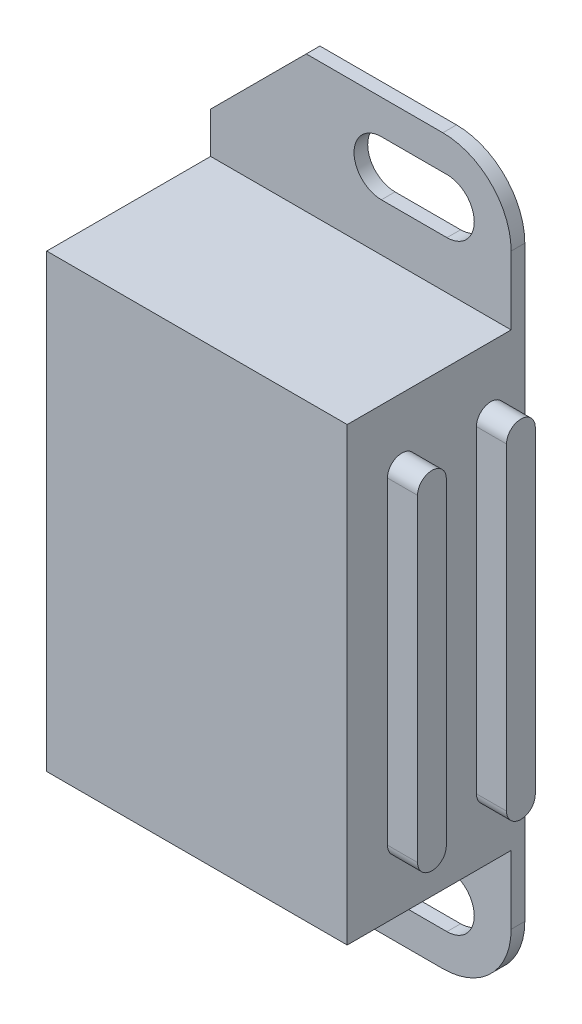
ISO-10303-21;
HEADER;
FILE_DESCRIPTION(('STEP AP214'),'2;1');
FILE_NAME('part.step','',(''),(''),'','','');
FILE_SCHEMA(('AUTOMOTIVE_DESIGN { 1 0 10303 214 1 1 1 1 }'));
ENDSEC;
DATA;
#1=APPLICATION_CONTEXT('core data for automotive mechanical design processes');
#2=APPLICATION_PROTOCOL_DEFINITION('international standard','automotive_design',2000,#1);
#3=PRODUCT_CONTEXT('',#1,'mechanical');
#4=PRODUCT('Part','Part','',(#3));
#5=PRODUCT_RELATED_PRODUCT_CATEGORY('part','',(#4));
#6=PRODUCT_DEFINITION_FORMATION('','',#4);
#7=PRODUCT_DEFINITION_CONTEXT('part definition',#1,'design');
#8=PRODUCT_DEFINITION('design','',#6,#7);
#9=PRODUCT_DEFINITION_SHAPE('','',#8);
#10=(LENGTH_UNIT() NAMED_UNIT(*) SI_UNIT(.MILLI.,.METRE.));
#11=(NAMED_UNIT(*) PLANE_ANGLE_UNIT() SI_UNIT($,.RADIAN.));
#12=(NAMED_UNIT(*) SI_UNIT($,.STERADIAN.) SOLID_ANGLE_UNIT());
#13=UNCERTAINTY_MEASURE_WITH_UNIT(LENGTH_MEASURE(1.E-05),#10,'distance_accuracy_value','');
#14=(GEOMETRIC_REPRESENTATION_CONTEXT(3) GLOBAL_UNCERTAINTY_ASSIGNED_CONTEXT((#13)) GLOBAL_UNIT_ASSIGNED_CONTEXT((#10,
#11,#12)) REPRESENTATION_CONTEXT('',''));
#15=CARTESIAN_POINT('',(0.,0.,0.));
#16=DIRECTION('',(0.,0.,1.));
#17=DIRECTION('',(1.,0.,0.));
#18=AXIS2_PLACEMENT_3D('',#15,#16,#17);
#19=CARTESIAN_POINT('',(11.,-26.5,1.));
#20=DIRECTION('',(-1.,0.,0.));
#21=DIRECTION('',(0.,0.,1.));
#22=AXIS2_PLACEMENT_3D('',#19,#20,#21);
#23=PLANE('',#22);
#24=CARTESIAN_POINT('',(11.,-11.6386215895724,9.));
#25=DIRECTION('',(1.,0.,0.));
#26=DIRECTION('',(0.,0.,-1.));
#27=AXIS2_PLACEMENT_3D('',#24,#25,#26);
#28=CIRCLE('',#27,1.05406384207447);
#29=CARTESIAN_POINT('',(11.,-11.6386215895724,10.0540638420745));
#30=VERTEX_POINT('',#29);
#31=CARTESIAN_POINT('',(11.,-11.6386215895724,7.94593615792553));
#32=VERTEX_POINT('',#31);
#33=EDGE_CURVE('E248',#30,#32,#28,.T.);
#34=ORIENTED_EDGE('',*,*,#33,.F.);
#35=DIRECTION('',(0.,-1.,0.));
#36=VECTOR('',#35,1.);
#37=CARTESIAN_POINT('',(11.,-11.6386215895724,10.0540638420745));
#38=LINE('',#37,#36);
#39=CARTESIAN_POINT('',(11.,11.6386215895724,10.0540638420745));
#40=VERTEX_POINT('',#39);
#41=EDGE_CURVE('E261',#40,#30,#38,.T.);
#42=ORIENTED_EDGE('',*,*,#41,.F.);
#43=CARTESIAN_POINT('',(11.,11.6386215895724,9.));
#44=DIRECTION('',(1.,0.,0.));
#45=DIRECTION('',(0.,0.,-1.));
#46=AXIS2_PLACEMENT_3D('',#43,#44,#45);
#47=CIRCLE('',#46,1.05406384207447);
#48=CARTESIAN_POINT('',(11.,11.6386215895724,7.94593615792553));
#49=VERTEX_POINT('',#48);
#50=EDGE_CURVE('E270',#49,#40,#47,.T.);
#51=ORIENTED_EDGE('',*,*,#50,.F.);
#52=DIRECTION('',(0.,1.,0.));
#53=VECTOR('',#52,1.);
#54=CARTESIAN_POINT('',(11.,-11.6386215895724,7.94593615792553));
#55=LINE('',#54,#53);
#56=EDGE_CURVE('E251',#32,#49,#55,.T.);
#57=ORIENTED_EDGE('',*,*,#56,.F.);
#58=EDGE_LOOP('',(#34,#42,#51,#57));
#59=FACE_BOUND('',#58,.T.);
#60=DIRECTION('',(0.,1.,0.));
#61=VECTOR('',#60,1.);
#62=CARTESIAN_POINT('',(11.,-26.5,1.));
#63=LINE('',#62,#61);
#64=CARTESIAN_POINT('',(11.,-21.5,1.));
#65=VERTEX_POINT('',#64);
#66=CARTESIAN_POINT('',(11.,-16.5,1.));
#67=VERTEX_POINT('',#66);
#68=EDGE_CURVE('E362',#65,#67,#63,.T.);
#69=ORIENTED_EDGE('',*,*,#68,.F.);
#70=DIRECTION('',(0.,0.,-1.));
#71=VECTOR('',#70,1.);
#72=CARTESIAN_POINT('',(11.,-21.5,1.));
#73=LINE('',#72,#71);
#74=CARTESIAN_POINT('',(11.,-21.5,0.));
#75=VERTEX_POINT('',#74);
#76=EDGE_CURVE('E375',#65,#75,#73,.T.);
#77=ORIENTED_EDGE('',*,*,#76,.T.);
#78=DIRECTION('',(0.,1.,0.));
#79=VECTOR('',#78,1.);
#80=CARTESIAN_POINT('',(11.,-26.5,0.));
#81=LINE('',#80,#79);
#82=CARTESIAN_POINT('',(11.,21.5,0.));
#83=VERTEX_POINT('',#82);
#84=EDGE_CURVE('E351',#75,#83,#81,.T.);
#85=ORIENTED_EDGE('',*,*,#84,.T.);
#86=DIRECTION('',(0.,0.,-1.));
#87=VECTOR('',#86,1.);
#88=CARTESIAN_POINT('',(11.,21.5,1.));
#89=LINE('',#88,#87);
#90=CARTESIAN_POINT('',(11.,21.5,1.));
#91=VERTEX_POINT('',#90);
#92=EDGE_CURVE('E373',#83,#91,#89,.F.);
#93=ORIENTED_EDGE('',*,*,#92,.T.);
#94=CARTESIAN_POINT('',(11.,16.5,1.));
#95=VERTEX_POINT('',#94);
#96=EDGE_CURVE('E361',#95,#91,#63,.T.);
#97=ORIENTED_EDGE('',*,*,#96,.F.);
#98=DIRECTION('',(0.,0.,-1.));
#99=VECTOR('',#98,1.);
#100=CARTESIAN_POINT('',(11.,16.5,13.));
#101=LINE('',#100,#99);
#102=CARTESIAN_POINT('',(11.,16.5,13.));
#103=VERTEX_POINT('',#102);
#104=EDGE_CURVE('E312',#103,#95,#101,.T.);
#105=ORIENTED_EDGE('',*,*,#104,.F.);
#106=DIRECTION('',(0.,1.,0.));
#107=VECTOR('',#106,1.);
#108=CARTESIAN_POINT('',(11.,-16.5,13.));
#109=LINE('',#108,#107);
#110=CARTESIAN_POINT('',(11.,-16.5,13.));
#111=VERTEX_POINT('',#110);
#112=EDGE_CURVE('E287',#111,#103,#109,.T.);
#113=ORIENTED_EDGE('',*,*,#112,.F.);
#114=DIRECTION('',(0.,0.,-1.));
#115=VECTOR('',#114,1.);
#116=CARTESIAN_POINT('',(11.,-16.5,13.));
#117=LINE('',#116,#115);
#118=EDGE_CURVE('E297',#111,#67,#117,.T.);
#119=ORIENTED_EDGE('',*,*,#118,.T.);
#120=EDGE_LOOP('',(#69,#77,#85,#93,#97,#105,#113,#119));
#121=FACE_BOUND('',#120,.T.);
#122=CARTESIAN_POINT('',(11.,-11.6386215895724,2.4863975939691));
#123=DIRECTION('',(1.,0.,0.));
#124=DIRECTION('',(0.,0.,1.));
#125=AXIS2_PLACEMENT_3D('',#122,#123,#124);
#126=CIRCLE('',#125,1.05406384207447);
#127=CARTESIAN_POINT('',(11.,-11.6386215895724,3.54046143604357));
#128=VERTEX_POINT('',#127);
#129=CARTESIAN_POINT('',(11.,-11.6386215895724,1.43233375189462));
#130=VERTEX_POINT('',#129);
#131=EDGE_CURVE('E247',#128,#130,#126,.T.);
#132=ORIENTED_EDGE('',*,*,#131,.F.);
#133=DIRECTION('',(0.,-1.,0.));
#134=VECTOR('',#133,1.);
#135=CARTESIAN_POINT('',(11.,-11.6386215895724,3.54046143604357));
#136=LINE('',#135,#134);
#137=CARTESIAN_POINT('',(11.,11.6386215895724,3.54046143604357));
#138=VERTEX_POINT('',#137);
#139=EDGE_CURVE('E244',#138,#128,#136,.T.);
#140=ORIENTED_EDGE('',*,*,#139,.F.);
#141=CARTESIAN_POINT('',(11.,11.6386215895724,2.4863975939691));
#142=DIRECTION('',(1.,0.,0.));
#143=DIRECTION('',(0.,0.,1.));
#144=AXIS2_PLACEMENT_3D('',#141,#142,#143);
#145=CIRCLE('',#144,1.05406384207447);
#146=CARTESIAN_POINT('',(11.,11.6386215895724,1.43233375189462));
#147=VERTEX_POINT('',#146);
#148=EDGE_CURVE('E835',#147,#138,#145,.T.);
#149=ORIENTED_EDGE('',*,*,#148,.F.);
#150=DIRECTION('',(0.,1.,0.));
#151=VECTOR('',#150,1.);
#152=CARTESIAN_POINT('',(11.,-11.6386215895724,1.43233375189462));
#153=LINE('',#152,#151);
#154=EDGE_CURVE('E841',#130,#147,#153,.T.);
#155=ORIENTED_EDGE('',*,*,#154,.F.);
#156=EDGE_LOOP('',(#132,#140,#149,#155));
#157=FACE_BOUND('',#156,.T.);
#158=ADVANCED_FACE('F37',(#59,#121,#157),#23,.F.);
#159=CARTESIAN_POINT('',(11.,26.5,1.));
#160=DIRECTION('',(0.,0.,-1.));
#161=DIRECTION('',(-1.,0.,0.));
#162=AXIS2_PLACEMENT_3D('',#159,#160,#161);
#163=PLANE('',#162);
#164=CARTESIAN_POINT('',(1.49999999999999,-22.,1.));
#165=DIRECTION('',(0.,0.,-1.));
#166=DIRECTION('',(1.,0.,0.));
#167=AXIS2_PLACEMENT_3D('',#164,#165,#166);
#168=CIRCLE('',#167,2.);
#169=CARTESIAN_POINT('',(1.49999999999999,-24.,1.));
#170=VERTEX_POINT('',#169);
#171=CARTESIAN_POINT('',(1.49999999999999,-20.,1.));
#172=VERTEX_POINT('',#171);
#173=EDGE_CURVE('E318',#170,#172,#168,.T.);
#174=ORIENTED_EDGE('',*,*,#173,.T.);
#175=DIRECTION('',(1.,0.,0.));
#176=VECTOR('',#175,1.);
#177=CARTESIAN_POINT('',(1.49999999999999,-20.,1.));
#178=LINE('',#177,#176);
#179=CARTESIAN_POINT('',(6.29999999999999,-20.,1.));
#180=VERTEX_POINT('',#179);
#181=EDGE_CURVE('E787',#172,#180,#178,.T.);
#182=ORIENTED_EDGE('',*,*,#181,.T.);
#183=CARTESIAN_POINT('',(6.29999999999999,-22.,1.));
#184=DIRECTION('',(0.,0.,-1.));
#185=DIRECTION('',(1.,0.,0.));
#186=AXIS2_PLACEMENT_3D('',#183,#184,#185);
#187=CIRCLE('',#186,1.99999999999999);
#188=CARTESIAN_POINT('',(6.29999999999999,-24.,1.));
#189=VERTEX_POINT('',#188);
#190=EDGE_CURVE('E791',#180,#189,#187,.T.);
#191=ORIENTED_EDGE('',*,*,#190,.T.);
#192=DIRECTION('',(-1.,0.,0.));
#193=VECTOR('',#192,1.);
#194=CARTESIAN_POINT('',(1.49999999999999,-24.,1.));
#195=LINE('',#194,#193);
#196=EDGE_CURVE('E794',#189,#170,#195,.T.);
#197=ORIENTED_EDGE('',*,*,#196,.T.);
#198=EDGE_LOOP('',(#174,#182,#191,#197));
#199=FACE_BOUND('',#198,.T.);
#200=DIRECTION('',(1.,0.,0.));
#201=VECTOR('',#200,1.);
#202=CARTESIAN_POINT('',(-11.,-26.5,1.));
#203=LINE('',#202,#201);
#204=CARTESIAN_POINT('',(-4.00000000000001,-26.5,1.));
#205=VERTEX_POINT('',#204);
#206=CARTESIAN_POINT('',(5.99999999999999,-26.5,1.));
#207=VERTEX_POINT('',#206);
#208=EDGE_CURVE('E335',#205,#207,#203,.T.);
#209=ORIENTED_EDGE('',*,*,#208,.T.);
#210=CARTESIAN_POINT('',(6.,-21.5,1.));
#211=DIRECTION('',(0.,0.,-1.));
#212=DIRECTION('',(-1.,0.,0.));
#213=AXIS2_PLACEMENT_3D('',#210,#211,#212);
#214=CIRCLE('',#213,5.);
#215=EDGE_CURVE('E383',#207,#65,#214,.F.);
#216=ORIENTED_EDGE('',*,*,#215,.T.);
#217=ORIENTED_EDGE('',*,*,#68,.T.);
#218=DIRECTION('',(1.,0.,0.));
#219=VECTOR('',#218,1.);
#220=CARTESIAN_POINT('',(-11.,-16.5,1.));
#221=LINE('',#220,#219);
#222=CARTESIAN_POINT('',(-11.,-16.5,1.));
#223=VERTEX_POINT('',#222);
#224=EDGE_CURVE('E291',#223,#67,#221,.T.);
#225=ORIENTED_EDGE('',*,*,#224,.F.);
#226=DIRECTION('',(0.,-1.,0.));
#227=VECTOR('',#226,1.);
#228=CARTESIAN_POINT('',(-11.,-26.5,1.));
#229=LINE('',#228,#227);
#230=CARTESIAN_POINT('',(-11.,-19.5,1.));
#231=VERTEX_POINT('',#230);
#232=EDGE_CURVE('E306',#223,#231,#229,.T.);
#233=ORIENTED_EDGE('',*,*,#232,.T.);
#234=DIRECTION('',(-0.707106781186546,0.707106781186549,0.));
#235=VECTOR('',#234,1.);
#236=CARTESIAN_POINT('',(-4.00000000000001,-26.5,1.));
#237=LINE('',#236,#235);
#238=EDGE_CURVE('E403',#231,#205,#237,.F.);
#239=ORIENTED_EDGE('',*,*,#238,.T.);
#240=EDGE_LOOP('',(#209,#216,#217,#225,#233,#239));
#241=FACE_BOUND('',#240,.T.);
#242=ADVANCED_FACE('F431',(#199,#241),#163,.F.);
#243=DIRECTION('',(1.,0.,0.));
#244=VECTOR('',#243,1.);
#245=CARTESIAN_POINT('',(1.49999999999999,20.,1.));
#246=LINE('',#245,#244);
#247=CARTESIAN_POINT('',(1.49999999999999,20.,1.));
#248=VERTEX_POINT('',#247);
#249=CARTESIAN_POINT('',(6.29999999999999,20.,1.));
#250=VERTEX_POINT('',#249);
#251=EDGE_CURVE('E746',#248,#250,#246,.T.);
#252=ORIENTED_EDGE('',*,*,#251,.F.);
#253=CARTESIAN_POINT('',(1.49999999999999,22.,1.));
#254=DIRECTION('',(0.,0.,1.));
#255=DIRECTION('',(1.,0.,0.));
#256=AXIS2_PLACEMENT_3D('',#253,#254,#255);
#257=CIRCLE('',#256,2.);
#258=CARTESIAN_POINT('',(1.49999999999999,24.,1.));
#259=VERTEX_POINT('',#258);
#260=EDGE_CURVE('E739',#259,#248,#257,.T.);
#261=ORIENTED_EDGE('',*,*,#260,.F.);
#262=DIRECTION('',(-1.,0.,0.));
#263=VECTOR('',#262,1.);
#264=CARTESIAN_POINT('',(1.49999999999999,24.,1.));
#265=LINE('',#264,#263);
#266=CARTESIAN_POINT('',(6.29999999999999,24.,1.));
#267=VERTEX_POINT('',#266);
#268=EDGE_CURVE('E760',#267,#259,#265,.T.);
#269=ORIENTED_EDGE('',*,*,#268,.F.);
#270=CARTESIAN_POINT('',(6.29999999999999,22.,1.));
#271=DIRECTION('',(0.,0.,1.));
#272=DIRECTION('',(1.,0.,0.));
#273=AXIS2_PLACEMENT_3D('',#270,#271,#272);
#274=CIRCLE('',#273,1.99999999999999);
#275=EDGE_CURVE('E758',#250,#267,#274,.T.);
#276=ORIENTED_EDGE('',*,*,#275,.F.);
#277=EDGE_LOOP('',(#252,#261,#269,#276));
#278=FACE_BOUND('',#277,.T.);
#279=ORIENTED_EDGE('',*,*,#96,.T.);
#280=CARTESIAN_POINT('',(5.99999999999999,21.5,1.));
#281=DIRECTION('',(0.,0.,-1.));
#282=DIRECTION('',(-1.,0.,0.));
#283=AXIS2_PLACEMENT_3D('',#280,#281,#282);
#284=CIRCLE('',#283,5.);
#285=CARTESIAN_POINT('',(5.99999999999999,26.5,1.));
#286=VERTEX_POINT('',#285);
#287=EDGE_CURVE('E11',#91,#286,#284,.F.);
#288=ORIENTED_EDGE('',*,*,#287,.T.);
#289=DIRECTION('',(-1.,0.,0.));
#290=VECTOR('',#289,1.);
#291=CARTESIAN_POINT('',(-11.,26.5,1.));
#292=LINE('',#291,#290);
#293=CARTESIAN_POINT('',(-3.99999999999998,26.5,1.));
#294=VERTEX_POINT('',#293);
#295=EDGE_CURVE('E347',#286,#294,#292,.T.);
#296=ORIENTED_EDGE('',*,*,#295,.T.);
#297=DIRECTION('',(0.707106781186549,0.707106781186546,0.));
#298=VECTOR('',#297,1.);
#299=CARTESIAN_POINT('',(-11.,19.5,1.));
#300=LINE('',#299,#298);
#301=CARTESIAN_POINT('',(-11.,19.5,1.));
#302=VERTEX_POINT('',#301);
#303=EDGE_CURVE('E371',#294,#302,#300,.F.);
#304=ORIENTED_EDGE('',*,*,#303,.T.);
#305=CARTESIAN_POINT('',(-11.,16.5,1.));
#306=VERTEX_POINT('',#305);
#307=EDGE_CURVE('E341',#302,#306,#229,.T.);
#308=ORIENTED_EDGE('',*,*,#307,.T.);
#309=DIRECTION('',(-1.,0.,0.));
#310=VECTOR('',#309,1.);
#311=CARTESIAN_POINT('',(-11.,16.5,1.));
#312=LINE('',#311,#310);
#313=EDGE_CURVE('E286',#95,#306,#312,.T.);
#314=ORIENTED_EDGE('',*,*,#313,.F.);
#315=EDGE_LOOP('',(#279,#288,#296,#304,#308,#314));
#316=FACE_BOUND('',#315,.T.);
#317=ADVANCED_FACE('F414',(#278,#316),#163,.F.);
#318=CARTESIAN_POINT('',(11.,26.5,0.));
#319=DIRECTION('',(0.,0.,-1.));
#320=DIRECTION('',(-1.,0.,0.));
#321=AXIS2_PLACEMENT_3D('',#318,#319,#320);
#322=PLANE('',#321);
#323=ORIENTED_EDGE('',*,*,#84,.F.);
#324=CARTESIAN_POINT('',(6.,-21.5,0.));
#325=DIRECTION('',(0.,0.,-1.));
#326=DIRECTION('',(-1.,0.,0.));
#327=AXIS2_PLACEMENT_3D('',#324,#325,#326);
#328=CIRCLE('',#327,5.);
#329=CARTESIAN_POINT('',(5.99999999999999,-26.5,0.));
#330=VERTEX_POINT('',#329);
#331=EDGE_CURVE('E380',#75,#330,#328,.T.);
#332=ORIENTED_EDGE('',*,*,#331,.T.);
#333=DIRECTION('',(1.,0.,0.));
#334=VECTOR('',#333,1.);
#335=CARTESIAN_POINT('',(-11.,-26.5,0.));
#336=LINE('',#335,#334);
#337=CARTESIAN_POINT('',(-4.00000000000001,-26.5,0.));
#338=VERTEX_POINT('',#337);
#339=EDGE_CURVE('E360',#338,#330,#336,.T.);
#340=ORIENTED_EDGE('',*,*,#339,.F.);
#341=DIRECTION('',(0.707106781186546,-0.707106781186549,0.));
#342=VECTOR('',#341,1.);
#343=CARTESIAN_POINT('',(-23.,-7.49999999999993,0.));
#344=LINE('',#343,#342);
#345=CARTESIAN_POINT('',(-11.,-19.5,0.));
#346=VERTEX_POINT('',#345);
#347=EDGE_CURVE('E338',#338,#346,#344,.F.);
#348=ORIENTED_EDGE('',*,*,#347,.T.);
#349=DIRECTION('',(0.,-1.,0.));
#350=VECTOR('',#349,1.);
#351=CARTESIAN_POINT('',(-11.,-26.5,0.));
#352=LINE('',#351,#350);
#353=CARTESIAN_POINT('',(-11.,19.5,0.));
#354=VERTEX_POINT('',#353);
#355=EDGE_CURVE('E357',#354,#346,#352,.T.);
#356=ORIENTED_EDGE('',*,*,#355,.F.);
#357=DIRECTION('',(-0.707106781186549,-0.707106781186546,0.));
#358=VECTOR('',#357,1.);
#359=CARTESIAN_POINT('',(3.50000000000003,34.,0.));
#360=LINE('',#359,#358);
#361=CARTESIAN_POINT('',(-3.99999999999998,26.5,0.));
#362=VERTEX_POINT('',#361);
#363=EDGE_CURVE('E334',#354,#362,#360,.F.);
#364=ORIENTED_EDGE('',*,*,#363,.T.);
#365=DIRECTION('',(-1.,0.,0.));
#366=VECTOR('',#365,1.);
#367=CARTESIAN_POINT('',(-11.,26.5,0.));
#368=LINE('',#367,#366);
#369=CARTESIAN_POINT('',(5.99999999999999,26.5,0.));
#370=VERTEX_POINT('',#369);
#371=EDGE_CURVE('E354',#370,#362,#368,.T.);
#372=ORIENTED_EDGE('',*,*,#371,.F.);
#373=CARTESIAN_POINT('',(5.99999999999999,21.5,0.));
#374=DIRECTION('',(0.,0.,-1.));
#375=DIRECTION('',(-1.,0.,0.));
#376=AXIS2_PLACEMENT_3D('',#373,#374,#375);
#377=CIRCLE('',#376,5.);
#378=EDGE_CURVE('E378',#370,#83,#377,.T.);
#379=ORIENTED_EDGE('',*,*,#378,.T.);
#380=EDGE_LOOP('',(#323,#332,#340,#348,#356,#364,#372,#379));
#381=FACE_BOUND('',#380,.T.);
#382=CARTESIAN_POINT('',(1.49999999999999,22.,0.));
#383=DIRECTION('',(0.,0.,1.));
#384=DIRECTION('',(1.,0.,0.));
#385=AXIS2_PLACEMENT_3D('',#382,#383,#384);
#386=CIRCLE('',#385,2.);
#387=CARTESIAN_POINT('',(1.49999999999999,24.,0.));
#388=VERTEX_POINT('',#387);
#389=CARTESIAN_POINT('',(1.49999999999999,20.,0.));
#390=VERTEX_POINT('',#389);
#391=EDGE_CURVE('E765',#388,#390,#386,.T.);
#392=ORIENTED_EDGE('',*,*,#391,.T.);
#393=DIRECTION('',(1.,0.,0.));
#394=VECTOR('',#393,1.);
#395=CARTESIAN_POINT('',(1.49999999999999,20.,0.));
#396=LINE('',#395,#394);
#397=CARTESIAN_POINT('',(6.29999999999999,20.,0.));
#398=VERTEX_POINT('',#397);
#399=EDGE_CURVE('E753',#390,#398,#396,.T.);
#400=ORIENTED_EDGE('',*,*,#399,.T.);
#401=CARTESIAN_POINT('',(6.29999999999999,22.,0.));
#402=DIRECTION('',(0.,0.,1.));
#403=DIRECTION('',(1.,0.,0.));
#404=AXIS2_PLACEMENT_3D('',#401,#402,#403);
#405=CIRCLE('',#404,1.99999999999999);
#406=CARTESIAN_POINT('',(6.29999999999999,24.,0.));
#407=VERTEX_POINT('',#406);
#408=EDGE_CURVE('E769',#398,#407,#405,.T.);
#409=ORIENTED_EDGE('',*,*,#408,.T.);
#410=DIRECTION('',(-1.,0.,0.));
#411=VECTOR('',#410,1.);
#412=CARTESIAN_POINT('',(1.49999999999999,24.,0.));
#413=LINE('',#412,#411);
#414=EDGE_CURVE('E756',#407,#388,#413,.T.);
#415=ORIENTED_EDGE('',*,*,#414,.T.);
#416=EDGE_LOOP('',(#392,#400,#409,#415));
#417=FACE_BOUND('',#416,.T.);
#418=DIRECTION('',(1.,0.,0.));
#419=VECTOR('',#418,1.);
#420=CARTESIAN_POINT('',(1.49999999999999,-20.,0.));
#421=LINE('',#420,#419);
#422=CARTESIAN_POINT('',(1.49999999999999,-20.,0.));
#423=VERTEX_POINT('',#422);
#424=CARTESIAN_POINT('',(6.29999999999999,-20.,0.));
#425=VERTEX_POINT('',#424);
#426=EDGE_CURVE('E781',#423,#425,#421,.T.);
#427=ORIENTED_EDGE('',*,*,#426,.F.);
#428=CARTESIAN_POINT('',(1.49999999999999,-22.,0.));
#429=DIRECTION('',(0.,0.,-1.));
#430=DIRECTION('',(1.,0.,0.));
#431=AXIS2_PLACEMENT_3D('',#428,#429,#430);
#432=CIRCLE('',#431,2.);
#433=CARTESIAN_POINT('',(1.49999999999999,-24.,0.));
#434=VERTEX_POINT('',#433);
#435=EDGE_CURVE('E790',#434,#423,#432,.T.);
#436=ORIENTED_EDGE('',*,*,#435,.F.);
#437=DIRECTION('',(-1.,0.,0.));
#438=VECTOR('',#437,1.);
#439=CARTESIAN_POINT('',(1.49999999999999,-24.,0.));
#440=LINE('',#439,#438);
#441=CARTESIAN_POINT('',(6.29999999999999,-24.,0.));
#442=VERTEX_POINT('',#441);
#443=EDGE_CURVE('E803',#442,#434,#440,.T.);
#444=ORIENTED_EDGE('',*,*,#443,.F.);
#445=CARTESIAN_POINT('',(6.29999999999999,-22.,0.));
#446=DIRECTION('',(0.,0.,-1.));
#447=DIRECTION('',(1.,0.,0.));
#448=AXIS2_PLACEMENT_3D('',#445,#446,#447);
#449=CIRCLE('',#448,1.99999999999999);
#450=EDGE_CURVE('E800',#425,#442,#449,.T.);
#451=ORIENTED_EDGE('',*,*,#450,.F.);
#452=EDGE_LOOP('',(#427,#436,#444,#451));
#453=FACE_BOUND('',#452,.T.);
#454=ADVANCED_FACE('F393',(#381,#417,#453),#322,.T.);
#455=CARTESIAN_POINT('',(-11.,26.5,1.));
#456=DIRECTION('',(0.,-1.,0.));
#457=DIRECTION('',(0.,0.,-1.));
#458=AXIS2_PLACEMENT_3D('',#455,#456,#457);
#459=PLANE('',#458);
#460=ORIENTED_EDGE('',*,*,#295,.F.);
#461=DIRECTION('',(0.,0.,-1.));
#462=VECTOR('',#461,1.);
#463=CARTESIAN_POINT('',(5.99999999999999,26.5,1.));
#464=LINE('',#463,#462);
#465=EDGE_CURVE('E45',#286,#370,#464,.T.);
#466=ORIENTED_EDGE('',*,*,#465,.T.);
#467=ORIENTED_EDGE('',*,*,#371,.T.);
#468=DIRECTION('',(0.,0.,1.));
#469=VECTOR('',#468,1.);
#470=CARTESIAN_POINT('',(-3.99999999999998,26.5,1.));
#471=LINE('',#470,#469);
#472=EDGE_CURVE('E401',#362,#294,#471,.T.);
#473=ORIENTED_EDGE('',*,*,#472,.T.);
#474=EDGE_LOOP('',(#460,#466,#467,#473));
#475=FACE_BOUND('',#474,.T.);
#476=ADVANCED_FACE('F388',(#475),#459,.F.);
#477=CARTESIAN_POINT('',(-11.,-26.5,1.));
#478=DIRECTION('',(1.,0.,0.));
#479=DIRECTION('',(0.,0.,-1.));
#480=AXIS2_PLACEMENT_3D('',#477,#478,#479);
#481=PLANE('',#480);
#482=ORIENTED_EDGE('',*,*,#355,.T.);
#483=DIRECTION('',(0.,0.,1.));
#484=VECTOR('',#483,1.);
#485=CARTESIAN_POINT('',(-11.,-19.5,1.));
#486=LINE('',#485,#484);
#487=EDGE_CURVE('E404',#346,#231,#486,.T.);
#488=ORIENTED_EDGE('',*,*,#487,.T.);
#489=ORIENTED_EDGE('',*,*,#232,.F.);
#490=DIRECTION('',(0.,0.,-1.));
#491=VECTOR('',#490,1.);
#492=CARTESIAN_POINT('',(-11.,-16.5,13.));
#493=LINE('',#492,#491);
#494=CARTESIAN_POINT('',(-11.,-16.5,13.));
#495=VERTEX_POINT('',#494);
#496=EDGE_CURVE('E313',#495,#223,#493,.T.);
#497=ORIENTED_EDGE('',*,*,#496,.F.);
#498=DIRECTION('',(0.,-1.,0.));
#499=VECTOR('',#498,1.);
#500=CARTESIAN_POINT('',(-11.,-16.5,13.));
#501=LINE('',#500,#499);
#502=CARTESIAN_POINT('',(-11.,16.5,13.));
#503=VERTEX_POINT('',#502);
#504=EDGE_CURVE('E293',#503,#495,#501,.T.);
#505=ORIENTED_EDGE('',*,*,#504,.F.);
#506=DIRECTION('',(0.,0.,-1.));
#507=VECTOR('',#506,1.);
#508=CARTESIAN_POINT('',(-11.,16.5,13.));
#509=LINE('',#508,#507);
#510=EDGE_CURVE('E309',#503,#306,#509,.T.);
#511=ORIENTED_EDGE('',*,*,#510,.T.);
#512=ORIENTED_EDGE('',*,*,#307,.F.);
#513=DIRECTION('',(0.,0.,-1.));
#514=VECTOR('',#513,1.);
#515=CARTESIAN_POINT('',(-11.,19.5,1.));
#516=LINE('',#515,#514);
#517=EDGE_CURVE('E340',#302,#354,#516,.T.);
#518=ORIENTED_EDGE('',*,*,#517,.T.);
#519=EDGE_LOOP('',(#482,#488,#489,#497,#505,#511,#512,#518));
#520=FACE_BOUND('',#519,.T.);
#521=ADVANCED_FACE('F411',(#520),#481,.F.);
#522=CARTESIAN_POINT('',(-11.,-26.5,1.));
#523=DIRECTION('',(0.,1.,0.));
#524=DIRECTION('',(0.,0.,1.));
#525=AXIS2_PLACEMENT_3D('',#522,#523,#524);
#526=PLANE('',#525);
#527=ORIENTED_EDGE('',*,*,#339,.T.);
#528=DIRECTION('',(0.,0.,-1.));
#529=VECTOR('',#528,1.);
#530=CARTESIAN_POINT('',(5.99999999999999,-26.5,1.));
#531=LINE('',#530,#529);
#532=EDGE_CURVE('E58',#330,#207,#531,.F.);
#533=ORIENTED_EDGE('',*,*,#532,.T.);
#534=ORIENTED_EDGE('',*,*,#208,.F.);
#535=DIRECTION('',(0.,0.,-1.));
#536=VECTOR('',#535,1.);
#537=CARTESIAN_POINT('',(-4.00000000000001,-26.5,1.));
#538=LINE('',#537,#536);
#539=EDGE_CURVE('E331',#205,#338,#538,.T.);
#540=ORIENTED_EDGE('',*,*,#539,.T.);
#541=EDGE_LOOP('',(#527,#533,#534,#540));
#542=FACE_BOUND('',#541,.T.);
#543=ADVANCED_FACE('F462',(#542),#526,.F.);
#544=CARTESIAN_POINT('',(1.49999999999999,22.,0.));
#545=DIRECTION('',(0.,0.,1.));
#546=DIRECTION('',(1.,0.,0.));
#547=AXIS2_PLACEMENT_3D('',#544,#545,#546);
#548=CYLINDRICAL_SURFACE('',#547,2.);
#549=ORIENTED_EDGE('',*,*,#260,.T.);
#550=DIRECTION('',(0.,0.,1.));
#551=VECTOR('',#550,1.);
#552=CARTESIAN_POINT('',(1.49999999999999,20.,0.));
#553=LINE('',#552,#551);
#554=EDGE_CURVE('E365',#390,#248,#553,.T.);
#555=ORIENTED_EDGE('',*,*,#554,.F.);
#556=ORIENTED_EDGE('',*,*,#391,.F.);
#557=DIRECTION('',(0.,0.,1.));
#558=VECTOR('',#557,1.);
#559=CARTESIAN_POINT('',(1.49999999999999,24.,0.));
#560=LINE('',#559,#558);
#561=EDGE_CURVE('E355',#388,#259,#560,.T.);
#562=ORIENTED_EDGE('',*,*,#561,.T.);
#563=EDGE_LOOP('',(#549,#555,#556,#562));
#564=FACE_BOUND('',#563,.T.);
#565=ADVANCED_FACE('F470',(#564),#548,.F.);
#566=CARTESIAN_POINT('',(1.49999999999999,24.,0.));
#567=DIRECTION('',(0.,1.,0.));
#568=DIRECTION('',(-1.,0.,0.));
#569=AXIS2_PLACEMENT_3D('',#566,#567,#568);
#570=PLANE('',#569);
#571=ORIENTED_EDGE('',*,*,#268,.T.);
#572=ORIENTED_EDGE('',*,*,#561,.F.);
#573=ORIENTED_EDGE('',*,*,#414,.F.);
#574=DIRECTION('',(0.,0.,1.));
#575=VECTOR('',#574,1.);
#576=CARTESIAN_POINT('',(6.29999999999999,24.,0.));
#577=LINE('',#576,#575);
#578=EDGE_CURVE('E767',#407,#267,#577,.T.);
#579=ORIENTED_EDGE('',*,*,#578,.T.);
#580=EDGE_LOOP('',(#571,#572,#573,#579));
#581=FACE_BOUND('',#580,.T.);
#582=ADVANCED_FACE('F714',(#581),#570,.F.);
#583=CARTESIAN_POINT('',(6.29999999999999,22.,0.));
#584=DIRECTION('',(0.,0.,1.));
#585=DIRECTION('',(1.,0.,0.));
#586=AXIS2_PLACEMENT_3D('',#583,#584,#585);
#587=CYLINDRICAL_SURFACE('',#586,1.99999999999999);
#588=ORIENTED_EDGE('',*,*,#275,.T.);
#589=ORIENTED_EDGE('',*,*,#578,.F.);
#590=ORIENTED_EDGE('',*,*,#408,.F.);
#591=DIRECTION('',(0.,0.,1.));
#592=VECTOR('',#591,1.);
#593=CARTESIAN_POINT('',(6.29999999999999,20.,0.));
#594=LINE('',#593,#592);
#595=EDGE_CURVE('E755',#398,#250,#594,.T.);
#596=ORIENTED_EDGE('',*,*,#595,.T.);
#597=EDGE_LOOP('',(#588,#589,#590,#596));
#598=FACE_BOUND('',#597,.T.);
#599=ADVANCED_FACE('F707',(#598),#587,.F.);
#600=CARTESIAN_POINT('',(1.49999999999999,20.,0.));
#601=DIRECTION('',(0.,-1.,0.));
#602=DIRECTION('',(1.,0.,0.));
#603=AXIS2_PLACEMENT_3D('',#600,#601,#602);
#604=PLANE('',#603);
#605=ORIENTED_EDGE('',*,*,#251,.T.);
#606=ORIENTED_EDGE('',*,*,#595,.F.);
#607=ORIENTED_EDGE('',*,*,#399,.F.);
#608=ORIENTED_EDGE('',*,*,#554,.T.);
#609=EDGE_LOOP('',(#605,#606,#607,#608));
#610=FACE_BOUND('',#609,.T.);
#611=ADVANCED_FACE('F700',(#610),#604,.F.);
#612=CARTESIAN_POINT('',(1.49999999999999,-22.,0.));
#613=DIRECTION('',(0.,0.,1.));
#614=DIRECTION('',(1.,0.,0.));
#615=AXIS2_PLACEMENT_3D('',#612,#613,#614);
#616=CYLINDRICAL_SURFACE('',#615,2.);
#617=ORIENTED_EDGE('',*,*,#173,.F.);
#618=DIRECTION('',(0.,0.,1.));
#619=VECTOR('',#618,1.);
#620=CARTESIAN_POINT('',(1.49999999999999,-24.,0.));
#621=LINE('',#620,#619);
#622=EDGE_CURVE('E777',#434,#170,#621,.T.);
#623=ORIENTED_EDGE('',*,*,#622,.F.);
#624=ORIENTED_EDGE('',*,*,#435,.T.);
#625=DIRECTION('',(0.,0.,1.));
#626=VECTOR('',#625,1.);
#627=CARTESIAN_POINT('',(1.49999999999999,-20.,0.));
#628=LINE('',#627,#626);
#629=EDGE_CURVE('E747',#423,#172,#628,.T.);
#630=ORIENTED_EDGE('',*,*,#629,.T.);
#631=EDGE_LOOP('',(#617,#623,#624,#630));
#632=FACE_BOUND('',#631,.T.);
#633=ADVANCED_FACE('F692',(#632),#616,.F.);
#634=CARTESIAN_POINT('',(1.49999999999999,-20.,0.));
#635=DIRECTION('',(0.,-1.,0.));
#636=DIRECTION('',(1.,0.,0.));
#637=AXIS2_PLACEMENT_3D('',#634,#635,#636);
#638=PLANE('',#637);
#639=ORIENTED_EDGE('',*,*,#181,.F.);
#640=ORIENTED_EDGE('',*,*,#629,.F.);
#641=ORIENTED_EDGE('',*,*,#426,.T.);
#642=DIRECTION('',(0.,0.,1.));
#643=VECTOR('',#642,1.);
#644=CARTESIAN_POINT('',(6.29999999999999,-20.,0.));
#645=LINE('',#644,#643);
#646=EDGE_CURVE('E783',#425,#180,#645,.T.);
#647=ORIENTED_EDGE('',*,*,#646,.T.);
#648=EDGE_LOOP('',(#639,#640,#641,#647));
#649=FACE_BOUND('',#648,.T.);
#650=ADVANCED_FACE('F684',(#649),#638,.T.);
#651=CARTESIAN_POINT('',(6.29999999999999,-22.,0.));
#652=DIRECTION('',(0.,0.,1.));
#653=DIRECTION('',(1.,0.,0.));
#654=AXIS2_PLACEMENT_3D('',#651,#652,#653);
#655=CYLINDRICAL_SURFACE('',#654,1.99999999999999);
#656=ORIENTED_EDGE('',*,*,#190,.F.);
#657=ORIENTED_EDGE('',*,*,#646,.F.);
#658=ORIENTED_EDGE('',*,*,#450,.T.);
#659=DIRECTION('',(0.,0.,1.));
#660=VECTOR('',#659,1.);
#661=CARTESIAN_POINT('',(6.29999999999999,-24.,0.));
#662=LINE('',#661,#660);
#663=EDGE_CURVE('E780',#442,#189,#662,.T.);
#664=ORIENTED_EDGE('',*,*,#663,.T.);
#665=EDGE_LOOP('',(#656,#657,#658,#664));
#666=FACE_BOUND('',#665,.T.);
#667=ADVANCED_FACE('F677',(#666),#655,.F.);
#668=CARTESIAN_POINT('',(1.49999999999999,-24.,0.));
#669=DIRECTION('',(0.,1.,0.));
#670=DIRECTION('',(-1.,0.,0.));
#671=AXIS2_PLACEMENT_3D('',#668,#669,#670);
#672=PLANE('',#671);
#673=ORIENTED_EDGE('',*,*,#196,.F.);
#674=ORIENTED_EDGE('',*,*,#663,.F.);
#675=ORIENTED_EDGE('',*,*,#443,.T.);
#676=ORIENTED_EDGE('',*,*,#622,.T.);
#677=EDGE_LOOP('',(#673,#674,#675,#676));
#678=FACE_BOUND('',#677,.T.);
#679=ADVANCED_FACE('F634',(#678),#672,.T.);
#680=CARTESIAN_POINT('',(-11.,16.5,13.));
#681=DIRECTION('',(0.,-1.,0.));
#682=DIRECTION('',(0.,0.,-1.));
#683=AXIS2_PLACEMENT_3D('',#680,#681,#682);
#684=PLANE('',#683);
#685=ORIENTED_EDGE('',*,*,#313,.T.);
#686=ORIENTED_EDGE('',*,*,#510,.F.);
#687=DIRECTION('',(-1.,0.,0.));
#688=VECTOR('',#687,1.);
#689=CARTESIAN_POINT('',(-11.,16.5,13.));
#690=LINE('',#689,#688);
#691=EDGE_CURVE('E290',#103,#503,#690,.T.);
#692=ORIENTED_EDGE('',*,*,#691,.F.);
#693=ORIENTED_EDGE('',*,*,#104,.T.);
#694=EDGE_LOOP('',(#685,#686,#692,#693));
#695=FACE_BOUND('',#694,.T.);
#696=ADVANCED_FACE('F417',(#695),#684,.F.);
#697=CARTESIAN_POINT('',(-11.,-16.5,13.));
#698=DIRECTION('',(0.,1.,0.));
#699=DIRECTION('',(0.,0.,1.));
#700=AXIS2_PLACEMENT_3D('',#697,#698,#699);
#701=PLANE('',#700);
#702=ORIENTED_EDGE('',*,*,#224,.T.);
#703=ORIENTED_EDGE('',*,*,#118,.F.);
#704=DIRECTION('',(1.,0.,0.));
#705=VECTOR('',#704,1.);
#706=CARTESIAN_POINT('',(-11.,-16.5,13.));
#707=LINE('',#706,#705);
#708=EDGE_CURVE('E295',#495,#111,#707,.T.);
#709=ORIENTED_EDGE('',*,*,#708,.F.);
#710=ORIENTED_EDGE('',*,*,#496,.T.);
#711=EDGE_LOOP('',(#702,#703,#709,#710));
#712=FACE_BOUND('',#711,.T.);
#713=ADVANCED_FACE('F633',(#712),#701,.F.);
#714=CARTESIAN_POINT('',(11.,16.5,13.));
#715=DIRECTION('',(0.,0.,-1.));
#716=DIRECTION('',(-1.,0.,0.));
#717=AXIS2_PLACEMENT_3D('',#714,#715,#716);
#718=PLANE('',#717);
#719=ORIENTED_EDGE('',*,*,#112,.T.);
#720=ORIENTED_EDGE('',*,*,#691,.T.);
#721=ORIENTED_EDGE('',*,*,#504,.T.);
#722=ORIENTED_EDGE('',*,*,#708,.T.);
#723=EDGE_LOOP('',(#719,#720,#721,#722));
#724=FACE_BOUND('',#723,.T.);
#725=ADVANCED_FACE('F527',(#724),#718,.F.);
#726=CARTESIAN_POINT('',(13.2,-11.6386215895724,9.));
#727=DIRECTION('',(-1.,0.,0.));
#728=DIRECTION('',(0.,0.,1.));
#729=AXIS2_PLACEMENT_3D('',#726,#727,#728);
#730=CYLINDRICAL_SURFACE('',#729,1.05406384207447);
#731=ORIENTED_EDGE('',*,*,#33,.T.);
#732=DIRECTION('',(-1.,0.,0.));
#733=VECTOR('',#732,1.);
#734=CARTESIAN_POINT('',(13.2,-11.6386215895724,7.94593615792553));
#735=LINE('',#734,#733);
#736=CARTESIAN_POINT('',(13.2,-11.6386215895724,7.94593615792553));
#737=VERTEX_POINT('',#736);
#738=EDGE_CURVE('E283',#737,#32,#735,.T.);
#739=ORIENTED_EDGE('',*,*,#738,.F.);
#740=CARTESIAN_POINT('',(13.2,-11.6386215895724,9.));
#741=DIRECTION('',(1.,0.,0.));
#742=DIRECTION('',(0.,0.,-1.));
#743=AXIS2_PLACEMENT_3D('',#740,#741,#742);
#744=CIRCLE('',#743,1.05406384207447);
#745=CARTESIAN_POINT('',(13.2,-11.6386215895724,10.0540638420745));
#746=VERTEX_POINT('',#745);
#747=EDGE_CURVE('E257',#746,#737,#744,.T.);
#748=ORIENTED_EDGE('',*,*,#747,.F.);
#749=DIRECTION('',(-1.,0.,0.));
#750=VECTOR('',#749,1.);
#751=CARTESIAN_POINT('',(13.2,-11.6386215895724,10.0540638420745));
#752=LINE('',#751,#750);
#753=EDGE_CURVE('E266',#746,#30,#752,.T.);
#754=ORIENTED_EDGE('',*,*,#753,.T.);
#755=EDGE_LOOP('',(#731,#739,#748,#754));
#756=FACE_BOUND('',#755,.T.);
#757=ADVANCED_FACE('F520',(#756),#730,.T.);
#758=CARTESIAN_POINT('',(13.2,-11.6386215895724,7.94593615792553));
#759=DIRECTION('',(0.,0.,1.));
#760=DIRECTION('',(1.,0.,0.));
#761=AXIS2_PLACEMENT_3D('',#758,#759,#760);
#762=PLANE('',#761);
#763=ORIENTED_EDGE('',*,*,#56,.T.);
#764=DIRECTION('',(-1.,0.,0.));
#765=VECTOR('',#764,1.);
#766=CARTESIAN_POINT('',(13.2,11.6386215895724,7.94593615792553));
#767=LINE('',#766,#765);
#768=CARTESIAN_POINT('',(13.2,11.6386215895724,7.94593615792553));
#769=VERTEX_POINT('',#768);
#770=EDGE_CURVE('E280',#769,#49,#767,.T.);
#771=ORIENTED_EDGE('',*,*,#770,.F.);
#772=DIRECTION('',(0.,1.,0.));
#773=VECTOR('',#772,1.);
#774=CARTESIAN_POINT('',(13.2,-11.6386215895724,7.94593615792553));
#775=LINE('',#774,#773);
#776=EDGE_CURVE('E260',#737,#769,#775,.T.);
#777=ORIENTED_EDGE('',*,*,#776,.F.);
#778=ORIENTED_EDGE('',*,*,#738,.T.);
#779=EDGE_LOOP('',(#763,#771,#777,#778));
#780=FACE_BOUND('',#779,.T.);
#781=ADVANCED_FACE('F526',(#780),#762,.F.);
#782=CARTESIAN_POINT('',(13.2,11.6386215895724,9.));
#783=DIRECTION('',(-1.,0.,0.));
#784=DIRECTION('',(0.,0.,1.));
#785=AXIS2_PLACEMENT_3D('',#782,#783,#784);
#786=CYLINDRICAL_SURFACE('',#785,1.05406384207447);
#787=ORIENTED_EDGE('',*,*,#50,.T.);
#788=DIRECTION('',(-1.,0.,0.));
#789=VECTOR('',#788,1.);
#790=CARTESIAN_POINT('',(13.2,11.6386215895724,10.0540638420745));
#791=LINE('',#790,#789);
#792=CARTESIAN_POINT('',(13.2,11.6386215895724,10.0540638420745));
#793=VERTEX_POINT('',#792);
#794=EDGE_CURVE('E277',#793,#40,#791,.T.);
#795=ORIENTED_EDGE('',*,*,#794,.F.);
#796=CARTESIAN_POINT('',(13.2,11.6386215895724,9.));
#797=DIRECTION('',(1.,0.,0.));
#798=DIRECTION('',(0.,0.,-1.));
#799=AXIS2_PLACEMENT_3D('',#796,#797,#798);
#800=CIRCLE('',#799,1.05406384207447);
#801=EDGE_CURVE('E263',#769,#793,#800,.T.);
#802=ORIENTED_EDGE('',*,*,#801,.F.);
#803=ORIENTED_EDGE('',*,*,#770,.T.);
#804=EDGE_LOOP('',(#787,#795,#802,#803));
#805=FACE_BOUND('',#804,.T.);
#806=ADVANCED_FACE('F538',(#805),#786,.T.);
#807=CARTESIAN_POINT('',(13.2,-11.6386215895724,10.0540638420745));
#808=DIRECTION('',(0.,0.,-1.));
#809=DIRECTION('',(-1.,0.,0.));
#810=AXIS2_PLACEMENT_3D('',#807,#808,#809);
#811=PLANE('',#810);
#812=ORIENTED_EDGE('',*,*,#41,.T.);
#813=ORIENTED_EDGE('',*,*,#753,.F.);
#814=DIRECTION('',(0.,-1.,0.));
#815=VECTOR('',#814,1.);
#816=CARTESIAN_POINT('',(13.2,-11.6386215895724,10.0540638420745));
#817=LINE('',#816,#815);
#818=EDGE_CURVE('E265',#793,#746,#817,.T.);
#819=ORIENTED_EDGE('',*,*,#818,.F.);
#820=ORIENTED_EDGE('',*,*,#794,.T.);
#821=EDGE_LOOP('',(#812,#813,#819,#820));
#822=FACE_BOUND('',#821,.T.);
#823=ADVANCED_FACE('F548',(#822),#811,.F.);
#824=CARTESIAN_POINT('',(13.2,-11.6386215895724,9.));
#825=DIRECTION('',(1.,0.,0.));
#826=DIRECTION('',(0.,0.,-1.));
#827=AXIS2_PLACEMENT_3D('',#824,#825,#826);
#828=PLANE('',#827);
#829=ORIENTED_EDGE('',*,*,#747,.T.);
#830=ORIENTED_EDGE('',*,*,#776,.T.);
#831=ORIENTED_EDGE('',*,*,#801,.T.);
#832=ORIENTED_EDGE('',*,*,#818,.T.);
#833=EDGE_LOOP('',(#829,#830,#831,#832));
#834=FACE_BOUND('',#833,.T.);
#835=ADVANCED_FACE('F558',(#834),#828,.T.);
#836=CARTESIAN_POINT('',(13.2,-11.6386215895724,2.4863975939691));
#837=DIRECTION('',(-1.,0.,0.));
#838=DIRECTION('',(0.,0.,1.));
#839=AXIS2_PLACEMENT_3D('',#836,#837,#838);
#840=CYLINDRICAL_SURFACE('',#839,1.05406384207447);
#841=ORIENTED_EDGE('',*,*,#131,.T.);
#842=DIRECTION('',(-1.,0.,0.));
#843=VECTOR('',#842,1.);
#844=CARTESIAN_POINT('',(13.2,-11.6386215895724,1.43233375189462));
#845=LINE('',#844,#843);
#846=CARTESIAN_POINT('',(13.2,-11.6386215895724,1.43233375189462));
#847=VERTEX_POINT('',#846);
#848=EDGE_CURVE('E228',#847,#130,#845,.T.);
#849=ORIENTED_EDGE('',*,*,#848,.F.);
#850=CARTESIAN_POINT('',(13.2,-11.6386215895724,2.4863975939691));
#851=DIRECTION('',(1.,0.,0.));
#852=DIRECTION('',(0.,0.,1.));
#853=AXIS2_PLACEMENT_3D('',#850,#851,#852);
#854=CIRCLE('',#853,1.05406384207447);
#855=CARTESIAN_POINT('',(13.2,-11.6386215895724,3.54046143604357));
#856=VERTEX_POINT('',#855);
#857=EDGE_CURVE('E235',#856,#847,#854,.T.);
#858=ORIENTED_EDGE('',*,*,#857,.F.);
#859=DIRECTION('',(-1.,0.,0.));
#860=VECTOR('',#859,1.);
#861=CARTESIAN_POINT('',(13.2,-11.6386215895724,3.54046143604357));
#862=LINE('',#861,#860);
#863=EDGE_CURVE('E832',#856,#128,#862,.T.);
#864=ORIENTED_EDGE('',*,*,#863,.T.);
#865=EDGE_LOOP('',(#841,#849,#858,#864));
#866=FACE_BOUND('',#865,.T.);
#867=ADVANCED_FACE('F246',(#866),#840,.T.);
#868=CARTESIAN_POINT('',(13.2,-11.6386215895724,1.43233375189462));
#869=DIRECTION('',(0.,0.,1.));
#870=DIRECTION('',(1.,0.,0.));
#871=AXIS2_PLACEMENT_3D('',#868,#869,#870);
#872=PLANE('',#871);
#873=ORIENTED_EDGE('',*,*,#154,.T.);
#874=DIRECTION('',(-1.,0.,0.));
#875=VECTOR('',#874,1.);
#876=CARTESIAN_POINT('',(13.2,11.6386215895724,1.43233375189462));
#877=LINE('',#876,#875);
#878=CARTESIAN_POINT('',(13.2,11.6386215895724,1.43233375189462));
#879=VERTEX_POINT('',#878);
#880=EDGE_CURVE('E231',#879,#147,#877,.T.);
#881=ORIENTED_EDGE('',*,*,#880,.F.);
#882=DIRECTION('',(0.,1.,0.));
#883=VECTOR('',#882,1.);
#884=CARTESIAN_POINT('',(13.2,-11.6386215895724,1.43233375189462));
#885=LINE('',#884,#883);
#886=EDGE_CURVE('E223',#847,#879,#885,.T.);
#887=ORIENTED_EDGE('',*,*,#886,.F.);
#888=ORIENTED_EDGE('',*,*,#848,.T.);
#889=EDGE_LOOP('',(#873,#881,#887,#888));
#890=FACE_BOUND('',#889,.T.);
#891=ADVANCED_FACE('F226',(#890),#872,.F.);
#892=CARTESIAN_POINT('',(13.2,11.6386215895724,2.4863975939691));
#893=DIRECTION('',(-1.,0.,0.));
#894=DIRECTION('',(0.,0.,1.));
#895=AXIS2_PLACEMENT_3D('',#892,#893,#894);
#896=CYLINDRICAL_SURFACE('',#895,1.05406384207447);
#897=ORIENTED_EDGE('',*,*,#148,.T.);
#898=DIRECTION('',(-1.,0.,0.));
#899=VECTOR('',#898,1.);
#900=CARTESIAN_POINT('',(13.2,11.6386215895724,3.54046143604357));
#901=LINE('',#900,#899);
#902=CARTESIAN_POINT('',(13.2,11.6386215895724,3.54046143604357));
#903=VERTEX_POINT('',#902);
#904=EDGE_CURVE('E253',#903,#138,#901,.T.);
#905=ORIENTED_EDGE('',*,*,#904,.F.);
#906=CARTESIAN_POINT('',(13.2,11.6386215895724,2.4863975939691));
#907=DIRECTION('',(1.,0.,0.));
#908=DIRECTION('',(0.,0.,1.));
#909=AXIS2_PLACEMENT_3D('',#906,#907,#908);
#910=CIRCLE('',#909,1.05406384207447);
#911=EDGE_CURVE('E234',#879,#903,#910,.T.);
#912=ORIENTED_EDGE('',*,*,#911,.F.);
#913=ORIENTED_EDGE('',*,*,#880,.T.);
#914=EDGE_LOOP('',(#897,#905,#912,#913));
#915=FACE_BOUND('',#914,.T.);
#916=ADVANCED_FACE('F585',(#915),#896,.T.);
#917=CARTESIAN_POINT('',(13.2,-11.6386215895724,3.54046143604357));
#918=DIRECTION('',(0.,0.,-1.));
#919=DIRECTION('',(-1.,0.,0.));
#920=AXIS2_PLACEMENT_3D('',#917,#918,#919);
#921=PLANE('',#920);
#922=ORIENTED_EDGE('',*,*,#139,.T.);
#923=ORIENTED_EDGE('',*,*,#863,.F.);
#924=DIRECTION('',(0.,-1.,0.));
#925=VECTOR('',#924,1.);
#926=CARTESIAN_POINT('',(13.2,-11.6386215895724,3.54046143604357));
#927=LINE('',#926,#925);
#928=EDGE_CURVE('E240',#903,#856,#927,.T.);
#929=ORIENTED_EDGE('',*,*,#928,.F.);
#930=ORIENTED_EDGE('',*,*,#904,.T.);
#931=EDGE_LOOP('',(#922,#923,#929,#930));
#932=FACE_BOUND('',#931,.T.);
#933=ADVANCED_FACE('F594',(#932),#921,.F.);
#934=CARTESIAN_POINT('',(13.2,-11.6386215895724,2.4863975939691));
#935=DIRECTION('',(-1.,0.,0.));
#936=DIRECTION('',(0.,0.,1.));
#937=AXIS2_PLACEMENT_3D('',#934,#935,#936);
#938=PLANE('',#937);
#939=ORIENTED_EDGE('',*,*,#857,.T.);
#940=ORIENTED_EDGE('',*,*,#886,.T.);
#941=ORIENTED_EDGE('',*,*,#911,.T.);
#942=ORIENTED_EDGE('',*,*,#928,.T.);
#943=EDGE_LOOP('',(#939,#940,#941,#942));
#944=FACE_BOUND('',#943,.T.);
#945=ADVANCED_FACE('F238',(#944),#938,.F.);
#946=CARTESIAN_POINT('',(-4.00000000000001,-26.5,1.));
#947=DIRECTION('',(0.707106781186549,0.707106781186546,0.));
#948=DIRECTION('',(0.,0.,-1.));
#949=AXIS2_PLACEMENT_3D('',#946,#947,#948);
#950=PLANE('',#949);
#951=ORIENTED_EDGE('',*,*,#238,.F.);
#952=ORIENTED_EDGE('',*,*,#487,.F.);
#953=ORIENTED_EDGE('',*,*,#347,.F.);
#954=ORIENTED_EDGE('',*,*,#539,.F.);
#955=EDGE_LOOP('',(#951,#952,#953,#954));
#956=FACE_BOUND('',#955,.T.);
#957=ADVANCED_FACE('F442',(#956),#950,.F.);
#958=CARTESIAN_POINT('',(-11.,19.5,1.));
#959=DIRECTION('',(0.707106781186546,-0.707106781186549,0.));
#960=DIRECTION('',(0.,0.,-1.));
#961=AXIS2_PLACEMENT_3D('',#958,#959,#960);
#962=PLANE('',#961);
#963=ORIENTED_EDGE('',*,*,#303,.F.);
#964=ORIENTED_EDGE('',*,*,#472,.F.);
#965=ORIENTED_EDGE('',*,*,#363,.F.);
#966=ORIENTED_EDGE('',*,*,#517,.F.);
#967=EDGE_LOOP('',(#963,#964,#965,#966));
#968=FACE_BOUND('',#967,.T.);
#969=ADVANCED_FACE('F402',(#968),#962,.F.);
#970=CARTESIAN_POINT('',(6.,-21.5,1.));
#971=DIRECTION('',(0.,0.,-1.));
#972=DIRECTION('',(-1.,0.,0.));
#973=AXIS2_PLACEMENT_3D('',#970,#971,#972);
#974=CYLINDRICAL_SURFACE('',#973,5.);
#975=ORIENTED_EDGE('',*,*,#215,.F.);
#976=ORIENTED_EDGE('',*,*,#532,.F.);
#977=ORIENTED_EDGE('',*,*,#331,.F.);
#978=ORIENTED_EDGE('',*,*,#76,.F.);
#979=EDGE_LOOP('',(#975,#976,#977,#978));
#980=FACE_BOUND('',#979,.T.);
#981=ADVANCED_FACE('F425',(#980),#974,.T.);
#982=CARTESIAN_POINT('',(5.99999999999999,21.5,1.));
#983=DIRECTION('',(0.,0.,-1.));
#984=DIRECTION('',(-1.,0.,0.));
#985=AXIS2_PLACEMENT_3D('',#982,#983,#984);
#986=CYLINDRICAL_SURFACE('',#985,5.);
#987=ORIENTED_EDGE('',*,*,#287,.F.);
#988=ORIENTED_EDGE('',*,*,#92,.F.);
#989=ORIENTED_EDGE('',*,*,#378,.F.);
#990=ORIENTED_EDGE('',*,*,#465,.F.);
#991=EDGE_LOOP('',(#987,#988,#989,#990));
#992=FACE_BOUND('',#991,.T.);
#993=ADVANCED_FACE('F39',(#992),#986,.T.);
#994=CLOSED_SHELL('',(#158,#242,#317,#454,#476,#521,#543,#565,#582,#599,#611,#633,#650,#667,
#679,#696,#713,#725,#757,#781,#806,#823,#835,#867,#891,#916,#933,#945,#957,#969,#981,#993));
#995=MANIFOLD_SOLID_BREP('B2',#994);
#996=ADVANCED_BREP_SHAPE_REPRESENTATION('',(#18,#995),#14);
#997=SHAPE_DEFINITION_REPRESENTATION(#9,#996);
ENDSEC;
END-ISO-10303-21;
